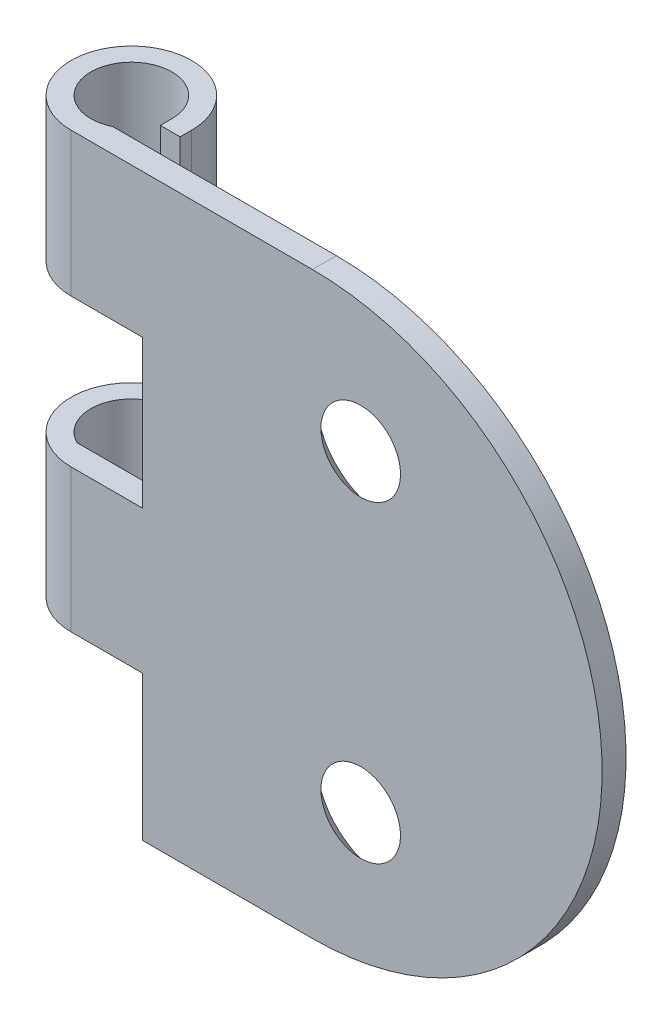
ISO-10303-21;
HEADER;
FILE_DESCRIPTION(('STEP AP214'),'2;1');
FILE_NAME('part.step','',(''),(''),'','','');
FILE_SCHEMA(('AUTOMOTIVE_DESIGN { 1 0 10303 214 1 1 1 1 }'));
ENDSEC;
DATA;
#1=APPLICATION_CONTEXT('core data for automotive mechanical design processes');
#2=APPLICATION_PROTOCOL_DEFINITION('international standard','automotive_design',2000,#1);
#3=PRODUCT_CONTEXT('',#1,'mechanical');
#4=PRODUCT('Part','Part','',(#3));
#5=PRODUCT_RELATED_PRODUCT_CATEGORY('part','',(#4));
#6=PRODUCT_DEFINITION_FORMATION('','',#4);
#7=PRODUCT_DEFINITION_CONTEXT('part definition',#1,'design');
#8=PRODUCT_DEFINITION('design','',#6,#7);
#9=PRODUCT_DEFINITION_SHAPE('','',#8);
#10=(LENGTH_UNIT() NAMED_UNIT(*) SI_UNIT(.MILLI.,.METRE.));
#11=(NAMED_UNIT(*) PLANE_ANGLE_UNIT() SI_UNIT($,.RADIAN.));
#12=(NAMED_UNIT(*) SI_UNIT($,.STERADIAN.) SOLID_ANGLE_UNIT());
#13=UNCERTAINTY_MEASURE_WITH_UNIT(LENGTH_MEASURE(1.E-05),#10,'distance_accuracy_value','');
#14=(GEOMETRIC_REPRESENTATION_CONTEXT(3) GLOBAL_UNCERTAINTY_ASSIGNED_CONTEXT((#13)) GLOBAL_UNIT_ASSIGNED_CONTEXT((#10,
#11,#12)) REPRESENTATION_CONTEXT('',''));
#15=CARTESIAN_POINT('',(0.,0.,0.));
#16=DIRECTION('',(0.,0.,1.));
#17=DIRECTION('',(1.,0.,0.));
#18=AXIS2_PLACEMENT_3D('',#15,#16,#17);
#19=CARTESIAN_POINT('',(4.699,19.05,-45.9665385922102));
#20=DIRECTION('',(-1.,0.,0.));
#21=DIRECTION('',(0.,-1.,0.));
#22=AXIS2_PLACEMENT_3D('',#19,#20,#21);
#23=PLANE('',#22);
#24=DIRECTION('',(0.,-1.,0.));
#25=VECTOR('',#24,1.);
#26=CARTESIAN_POINT('',(4.699,19.05,3.96875));
#27=LINE('',#26,#25);
#28=CARTESIAN_POINT('',(4.699,9.6012,3.96875));
#29=VERTEX_POINT('',#28);
#30=CARTESIAN_POINT('',(4.699,-0.126999999999999,3.96875));
#31=VERTEX_POINT('',#30);
#32=EDGE_CURVE('E253',#29,#31,#27,.T.);
#33=ORIENTED_EDGE('',*,*,#32,.F.);
#34=DIRECTION('',(0.,0.,-1.));
#35=VECTOR('',#34,1.);
#36=CARTESIAN_POINT('',(4.699,9.6012,2.667));
#37=LINE('',#36,#35);
#38=CARTESIAN_POINT('',(4.699,9.6012,2.39395));
#39=VERTEX_POINT('',#38);
#40=EDGE_CURVE('E218',#29,#39,#37,.T.);
#41=ORIENTED_EDGE('',*,*,#40,.T.);
#42=DIRECTION('',(0.,-1.,0.));
#43=VECTOR('',#42,1.);
#44=CARTESIAN_POINT('',(4.699,19.05,2.39395));
#45=LINE('',#44,#43);
#46=CARTESIAN_POINT('',(4.699,-0.126999999999999,2.39395));
#47=VERTEX_POINT('',#46);
#48=EDGE_CURVE('E80',#39,#47,#45,.T.);
#49=ORIENTED_EDGE('',*,*,#48,.T.);
#50=DIRECTION('',(0.,0.,1.));
#51=VECTOR('',#50,1.);
#52=CARTESIAN_POINT('',(4.699,-0.126999999999999,2.667));
#53=LINE('',#52,#51);
#54=EDGE_CURVE('E210',#47,#31,#53,.T.);
#55=ORIENTED_EDGE('',*,*,#54,.T.);
#56=EDGE_LOOP('',(#33,#41,#49,#55));
#57=FACE_BOUND('',#56,.T.);
#58=ADVANCED_FACE('F46',(#57),#23,.T.);
#59=CARTESIAN_POINT('',(0.,11.6260334940602,3.96875));
#60=DIRECTION('',(0.,0.,-1.));
#61=DIRECTION('',(-1.,0.,0.));
#62=AXIS2_PLACEMENT_3D('',#59,#60,#61);
#63=PLANE('',#62);
#64=CARTESIAN_POINT('',(19.05,10.287,3.96875));
#65=DIRECTION('',(0.,0.,-1.));
#66=DIRECTION('',(-1.,0.,0.));
#67=AXIS2_PLACEMENT_3D('',#64,#65,#66);
#68=CIRCLE('',#67,2.61582226084048);
#69=CARTESIAN_POINT('',(16.4341777391595,10.287,3.96875));
#70=VERTEX_POINT('',#69);
#71=EDGE_CURVE('E240',#70,#70,#68,.T.);
#72=ORIENTED_EDGE('',*,*,#71,.T.);
#73=EDGE_LOOP('',(#72));
#74=FACE_BOUND('',#73,.T.);
#75=CARTESIAN_POINT('',(19.05,-10.287,3.96875));
#76=DIRECTION('',(0.,0.,-1.));
#77=DIRECTION('',(-1.,0.,0.));
#78=AXIS2_PLACEMENT_3D('',#75,#76,#77);
#79=CIRCLE('',#78,2.61582226084048);
#80=CARTESIAN_POINT('',(16.4341777391595,-10.287,3.96875));
#81=VERTEX_POINT('',#80);
#82=EDGE_CURVE('E239',#81,#81,#79,.T.);
#83=ORIENTED_EDGE('',*,*,#82,.T.);
#84=EDGE_LOOP('',(#83));
#85=FACE_BOUND('',#84,.T.);
#86=DIRECTION('',(1.,0.,0.));
#87=VECTOR('',#86,1.);
#88=CARTESIAN_POINT('',(0.,-0.126999999999999,3.96875));
#89=LINE('',#88,#87);
#90=CARTESIAN_POINT('',(0.,-0.126999999999999,3.96875));
#91=VERTEX_POINT('',#90);
#92=EDGE_CURVE('E56',#91,#31,#89,.T.);
#93=ORIENTED_EDGE('',*,*,#92,.F.);
#94=DIRECTION('',(0.,-1.,0.));
#95=VECTOR('',#94,1.);
#96=CARTESIAN_POINT('',(0.,11.6260334940602,3.96875));
#97=LINE('',#96,#95);
#98=CARTESIAN_POINT('',(0.,-9.525,3.96875));
#99=VERTEX_POINT('',#98);
#100=EDGE_CURVE('E301',#91,#99,#97,.T.);
#101=ORIENTED_EDGE('',*,*,#100,.T.);
#102=DIRECTION('',(1.,0.,0.));
#103=VECTOR('',#102,1.);
#104=CARTESIAN_POINT('',(0.,-9.525,3.96875));
#105=LINE('',#104,#103);
#106=CARTESIAN_POINT('',(4.699,-9.525,3.96875));
#107=VERTEX_POINT('',#106);
#108=EDGE_CURVE('E211',#99,#107,#105,.T.);
#109=ORIENTED_EDGE('',*,*,#108,.T.);
#110=CARTESIAN_POINT('',(4.699,-19.05,3.96875));
#111=VERTEX_POINT('',#110);
#112=EDGE_CURVE('E257',#107,#111,#27,.T.);
#113=ORIENTED_EDGE('',*,*,#112,.T.);
#114=DIRECTION('',(1.,0.,0.));
#115=VECTOR('',#114,1.);
#116=CARTESIAN_POINT('',(4.699,-19.05,3.96875));
#117=LINE('',#116,#115);
#118=CARTESIAN_POINT('',(15.875,-19.05,3.96875));
#119=VERTEX_POINT('',#118);
#120=EDGE_CURVE('E256',#111,#119,#117,.T.);
#121=ORIENTED_EDGE('',*,*,#120,.T.);
#122=CARTESIAN_POINT('',(15.875,0.,3.96875));
#123=DIRECTION('',(0.,0.,1.));
#124=DIRECTION('',(1.,0.,0.));
#125=AXIS2_PLACEMENT_3D('',#122,#123,#124);
#126=CIRCLE('',#125,19.05);
#127=CARTESIAN_POINT('',(15.875,19.05,3.96875));
#128=VERTEX_POINT('',#127);
#129=EDGE_CURVE('E302',#119,#128,#126,.T.);
#130=ORIENTED_EDGE('',*,*,#129,.T.);
#131=DIRECTION('',(-1.,0.,0.));
#132=VECTOR('',#131,1.);
#133=CARTESIAN_POINT('',(15.875,19.05,3.96875));
#134=LINE('',#133,#132);
#135=CARTESIAN_POINT('',(0.,19.05,3.96875));
#136=VERTEX_POINT('',#135);
#137=EDGE_CURVE('E264',#128,#136,#134,.T.);
#138=ORIENTED_EDGE('',*,*,#137,.T.);
#139=DIRECTION('',(0.,1.,0.));
#140=VECTOR('',#139,1.);
#141=CARTESIAN_POINT('',(0.,-2.22803349406016,3.96875));
#142=LINE('',#141,#140);
#143=CARTESIAN_POINT('',(0.,9.6012,3.96875));
#144=VERTEX_POINT('',#143);
#145=EDGE_CURVE('E323',#144,#136,#142,.T.);
#146=ORIENTED_EDGE('',*,*,#145,.F.);
#147=DIRECTION('',(-1.,0.,0.));
#148=VECTOR('',#147,1.);
#149=CARTESIAN_POINT('',(0.,9.6012,3.96875));
#150=LINE('',#149,#148);
#151=EDGE_CURVE('E224',#29,#144,#150,.T.);
#152=ORIENTED_EDGE('',*,*,#151,.F.);
#153=ORIENTED_EDGE('',*,*,#32,.T.);
#154=EDGE_LOOP('',(#93,#101,#109,#113,#121,#130,#138,#146,#152,#153));
#155=FACE_BOUND('',#154,.T.);
#156=ADVANCED_FACE('F307',(#74,#85,#155),#63,.F.);
#157=CARTESIAN_POINT('',(0.,11.6260334940602,2.39395));
#158=DIRECTION('',(0.,0.,-1.));
#159=DIRECTION('',(-1.,0.,0.));
#160=AXIS2_PLACEMENT_3D('',#157,#158,#159);
#161=PLANE('',#160);
#162=CARTESIAN_POINT('',(19.05,10.287,2.39395));
#163=DIRECTION('',(0.,0.,-1.));
#164=DIRECTION('',(-1.,0.,0.));
#165=AXIS2_PLACEMENT_3D('',#162,#163,#164);
#166=CIRCLE('',#165,4.49259581845785);
#167=CARTESIAN_POINT('',(14.5574041815421,10.287,2.39395));
#168=VERTEX_POINT('',#167);
#169=EDGE_CURVE('E241',#168,#168,#166,.T.);
#170=ORIENTED_EDGE('',*,*,#169,.F.);
#171=EDGE_LOOP('',(#170));
#172=FACE_BOUND('',#171,.T.);
#173=CARTESIAN_POINT('',(19.05,-10.287,2.39395));
#174=DIRECTION('',(0.,0.,-1.));
#175=DIRECTION('',(-1.,0.,0.));
#176=AXIS2_PLACEMENT_3D('',#173,#174,#175);
#177=CIRCLE('',#176,4.49259581845785);
#178=CARTESIAN_POINT('',(14.5574041815421,-10.287,2.39395));
#179=VERTEX_POINT('',#178);
#180=EDGE_CURVE('E236',#179,#179,#177,.T.);
#181=ORIENTED_EDGE('',*,*,#180,.F.);
#182=EDGE_LOOP('',(#181));
#183=FACE_BOUND('',#182,.T.);
#184=DIRECTION('',(0.,-1.,0.));
#185=VECTOR('',#184,1.);
#186=CARTESIAN_POINT('',(-1.17553919436997,11.6260334940602,2.39395));
#187=LINE('',#186,#185);
#188=CARTESIAN_POINT('',(-1.17553919436997,-0.126999999999999,2.39395));
#189=VERTEX_POINT('',#188);
#190=CARTESIAN_POINT('',(-1.17553919436997,-9.525,2.39395));
#191=VERTEX_POINT('',#190);
#192=EDGE_CURVE('E50',#189,#191,#187,.T.);
#193=ORIENTED_EDGE('',*,*,#192,.F.);
#194=DIRECTION('',(1.,0.,0.));
#195=VECTOR('',#194,1.);
#196=CARTESIAN_POINT('',(0.,-0.126999999999999,2.39395));
#197=LINE('',#196,#195);
#198=EDGE_CURVE('E199',#189,#47,#197,.T.);
#199=ORIENTED_EDGE('',*,*,#198,.T.);
#200=ORIENTED_EDGE('',*,*,#48,.F.);
#201=DIRECTION('',(-1.,0.,0.));
#202=VECTOR('',#201,1.);
#203=CARTESIAN_POINT('',(0.,9.6012,2.39395));
#204=LINE('',#203,#202);
#205=CARTESIAN_POINT('',(1.17553919436997,9.6012,2.39395));
#206=VERTEX_POINT('',#205);
#207=EDGE_CURVE('E65',#39,#206,#204,.T.);
#208=ORIENTED_EDGE('',*,*,#207,.T.);
#209=DIRECTION('',(0.,1.,0.));
#210=VECTOR('',#209,1.);
#211=CARTESIAN_POINT('',(1.17553919436997,-2.22803349406016,2.39395));
#212=LINE('',#211,#210);
#213=CARTESIAN_POINT('',(1.17553919436997,19.05,2.39395));
#214=VERTEX_POINT('',#213);
#215=EDGE_CURVE('E219',#206,#214,#212,.T.);
#216=ORIENTED_EDGE('',*,*,#215,.T.);
#217=DIRECTION('',(-1.,0.,0.));
#218=VECTOR('',#217,1.);
#219=CARTESIAN_POINT('',(15.875,19.05,2.39395));
#220=LINE('',#219,#218);
#221=CARTESIAN_POINT('',(15.875,19.05,2.39395));
#222=VERTEX_POINT('',#221);
#223=EDGE_CURVE('E106',#222,#214,#220,.T.);
#224=ORIENTED_EDGE('',*,*,#223,.F.);
#225=CARTESIAN_POINT('',(15.875,0.,2.39395));
#226=DIRECTION('',(0.,0.,-1.));
#227=DIRECTION('',(-1.,0.,0.));
#228=AXIS2_PLACEMENT_3D('',#225,#226,#227);
#229=CIRCLE('',#228,19.05);
#230=CARTESIAN_POINT('',(15.875,-19.05,2.39395));
#231=VERTEX_POINT('',#230);
#232=EDGE_CURVE('E223',#231,#222,#229,.F.);
#233=ORIENTED_EDGE('',*,*,#232,.F.);
#234=DIRECTION('',(1.,0.,0.));
#235=VECTOR('',#234,1.);
#236=CARTESIAN_POINT('',(4.699,-19.05,2.39395));
#237=LINE('',#236,#235);
#238=CARTESIAN_POINT('',(4.699,-19.05,2.39395));
#239=VERTEX_POINT('',#238);
#240=EDGE_CURVE('E228',#239,#231,#237,.T.);
#241=ORIENTED_EDGE('',*,*,#240,.F.);
#242=DIRECTION('',(0.,-1.,0.));
#243=VECTOR('',#242,1.);
#244=CARTESIAN_POINT('',(4.699,19.05,2.39395));
#245=LINE('',#244,#243);
#246=CARTESIAN_POINT('',(4.699,-9.525,2.39395));
#247=VERTEX_POINT('',#246);
#248=EDGE_CURVE('E91',#247,#239,#245,.T.);
#249=ORIENTED_EDGE('',*,*,#248,.F.);
#250=DIRECTION('',(1.,0.,0.));
#251=VECTOR('',#250,1.);
#252=CARTESIAN_POINT('',(0.,-9.525,2.39395));
#253=LINE('',#252,#251);
#254=EDGE_CURVE('E204',#191,#247,#253,.T.);
#255=ORIENTED_EDGE('',*,*,#254,.F.);
#256=EDGE_LOOP('',(#193,#199,#200,#208,#216,#224,#233,#241,#249,#255));
#257=FACE_BOUND('',#256,.T.);
#258=ADVANCED_FACE('F48',(#172,#183,#257),#161,.T.);
#259=CARTESIAN_POINT('',(0.,11.6260334940602,0.));
#260=DIRECTION('',(0.,-1.,0.));
#261=DIRECTION('',(0.,0.,-1.));
#262=AXIS2_PLACEMENT_3D('',#259,#260,#261);
#263=CYLINDRICAL_SURFACE('',#262,2.667);
#264=DIRECTION('',(0.,-1.,0.));
#265=VECTOR('',#264,1.);
#266=CARTESIAN_POINT('',(2.667,11.6260334940602,0.));
#267=LINE('',#266,#265);
#268=CARTESIAN_POINT('',(2.667,-0.126999999999999,0.));
#269=VERTEX_POINT('',#268);
#270=CARTESIAN_POINT('',(2.667,-9.525,0.));
#271=VERTEX_POINT('',#270);
#272=EDGE_CURVE('E195',#269,#271,#267,.T.);
#273=ORIENTED_EDGE('',*,*,#272,.F.);
#274=CARTESIAN_POINT('',(0.,-0.126999999999999,0.));
#275=DIRECTION('',(0.,1.,0.));
#276=DIRECTION('',(0.,0.,1.));
#277=AXIS2_PLACEMENT_3D('',#274,#275,#276);
#278=CIRCLE('',#277,2.667);
#279=EDGE_CURVE('E193',#269,#189,#278,.T.);
#280=ORIENTED_EDGE('',*,*,#279,.T.);
#281=ORIENTED_EDGE('',*,*,#192,.T.);
#282=CARTESIAN_POINT('',(0.,-9.525,0.));
#283=DIRECTION('',(0.,1.,0.));
#284=DIRECTION('',(0.,0.,1.));
#285=AXIS2_PLACEMENT_3D('',#282,#283,#284);
#286=CIRCLE('',#285,2.667);
#287=EDGE_CURVE('E235',#271,#191,#286,.T.);
#288=ORIENTED_EDGE('',*,*,#287,.F.);
#289=EDGE_LOOP('',(#273,#280,#281,#288));
#290=FACE_BOUND('',#289,.T.);
#291=ADVANCED_FACE('F194',(#290),#263,.F.);
#292=CARTESIAN_POINT('',(2.667,11.6260334940602,0.762));
#293=DIRECTION('',(-1.,0.,0.));
#294=DIRECTION('',(0.,0.,1.));
#295=AXIS2_PLACEMENT_3D('',#292,#293,#294);
#296=PLANE('',#295);
#297=DIRECTION('',(0.,-1.,0.));
#298=VECTOR('',#297,1.);
#299=CARTESIAN_POINT('',(2.667,11.6260334940602,0.762));
#300=LINE('',#299,#298);
#301=CARTESIAN_POINT('',(2.667,-0.126999999999999,0.762));
#302=VERTEX_POINT('',#301);
#303=CARTESIAN_POINT('',(2.667,-9.525,0.762));
#304=VERTEX_POINT('',#303);
#305=EDGE_CURVE('E297',#302,#304,#300,.T.);
#306=ORIENTED_EDGE('',*,*,#305,.F.);
#307=DIRECTION('',(0.,0.,-1.));
#308=VECTOR('',#307,1.);
#309=CARTESIAN_POINT('',(2.667,-0.126999999999999,0.762));
#310=LINE('',#309,#308);
#311=EDGE_CURVE('E206',#302,#269,#310,.T.);
#312=ORIENTED_EDGE('',*,*,#311,.T.);
#313=ORIENTED_EDGE('',*,*,#272,.T.);
#314=DIRECTION('',(0.,0.,-1.));
#315=VECTOR('',#314,1.);
#316=CARTESIAN_POINT('',(2.667,-9.525,0.762));
#317=LINE('',#316,#315);
#318=EDGE_CURVE('E245',#304,#271,#317,.T.);
#319=ORIENTED_EDGE('',*,*,#318,.F.);
#320=EDGE_LOOP('',(#306,#312,#313,#319));
#321=FACE_BOUND('',#320,.T.);
#322=ADVANCED_FACE('F382',(#321),#296,.T.);
#323=CARTESIAN_POINT('',(3.96875,11.6260334940602,0.762));
#324=DIRECTION('',(0.,0.,1.));
#325=DIRECTION('',(1.,0.,0.));
#326=AXIS2_PLACEMENT_3D('',#323,#324,#325);
#327=PLANE('',#326);
#328=DIRECTION('',(0.,-1.,0.));
#329=VECTOR('',#328,1.);
#330=CARTESIAN_POINT('',(3.96875,11.6260334940602,0.762));
#331=LINE('',#330,#329);
#332=CARTESIAN_POINT('',(3.96875,-0.126999999999999,0.762));
#333=VERTEX_POINT('',#332);
#334=CARTESIAN_POINT('',(3.96875,-9.525,0.762));
#335=VERTEX_POINT('',#334);
#336=EDGE_CURVE('E277',#333,#335,#331,.T.);
#337=ORIENTED_EDGE('',*,*,#336,.F.);
#338=DIRECTION('',(-1.,0.,0.));
#339=VECTOR('',#338,1.);
#340=CARTESIAN_POINT('',(3.96875,-0.126999999999999,0.762));
#341=LINE('',#340,#339);
#342=EDGE_CURVE('E296',#333,#302,#341,.T.);
#343=ORIENTED_EDGE('',*,*,#342,.T.);
#344=ORIENTED_EDGE('',*,*,#305,.T.);
#345=DIRECTION('',(-1.,0.,0.));
#346=VECTOR('',#345,1.);
#347=CARTESIAN_POINT('',(3.96875,-9.525,0.762));
#348=LINE('',#347,#346);
#349=EDGE_CURVE('E272',#335,#304,#348,.T.);
#350=ORIENTED_EDGE('',*,*,#349,.F.);
#351=EDGE_LOOP('',(#337,#343,#344,#350));
#352=FACE_BOUND('',#351,.T.);
#353=ADVANCED_FACE('F385',(#352),#327,.T.);
#354=CARTESIAN_POINT('',(3.96875,11.6260334940602,0.762));
#355=DIRECTION('',(-1.,0.,0.));
#356=DIRECTION('',(0.,0.,1.));
#357=AXIS2_PLACEMENT_3D('',#354,#355,#356);
#358=PLANE('',#357);
#359=DIRECTION('',(0.,0.,-1.));
#360=VECTOR('',#359,1.);
#361=CARTESIAN_POINT('',(3.96875,-0.126999999999999,0.762));
#362=LINE('',#361,#360);
#363=CARTESIAN_POINT('',(3.96875,-0.126999999999999,0.));
#364=VERTEX_POINT('',#363);
#365=EDGE_CURVE('E14',#333,#364,#362,.T.);
#366=ORIENTED_EDGE('',*,*,#365,.F.);
#367=ORIENTED_EDGE('',*,*,#336,.T.);
#368=DIRECTION('',(0.,0.,-1.));
#369=VECTOR('',#368,1.);
#370=CARTESIAN_POINT('',(3.96875,-9.525,0.762));
#371=LINE('',#370,#369);
#372=CARTESIAN_POINT('',(3.96875,-9.525,0.));
#373=VERTEX_POINT('',#372);
#374=EDGE_CURVE('E274',#335,#373,#371,.T.);
#375=ORIENTED_EDGE('',*,*,#374,.T.);
#376=DIRECTION('',(0.,-1.,0.));
#377=VECTOR('',#376,1.);
#378=CARTESIAN_POINT('',(3.96875,11.6260334940602,0.));
#379=LINE('',#378,#377);
#380=EDGE_CURVE('E273',#364,#373,#379,.T.);
#381=ORIENTED_EDGE('',*,*,#380,.F.);
#382=EDGE_LOOP('',(#366,#367,#375,#381));
#383=FACE_BOUND('',#382,.T.);
#384=ADVANCED_FACE('F389',(#383),#358,.F.);
#385=CARTESIAN_POINT('',(0.,11.6260334940602,0.));
#386=DIRECTION('',(0.,-1.,0.));
#387=DIRECTION('',(0.,0.,-1.));
#388=AXIS2_PLACEMENT_3D('',#385,#386,#387);
#389=CYLINDRICAL_SURFACE('',#388,3.96875);
#390=CARTESIAN_POINT('',(0.,-0.126999999999999,0.));
#391=DIRECTION('',(0.,1.,0.));
#392=DIRECTION('',(0.,0.,1.));
#393=AXIS2_PLACEMENT_3D('',#390,#391,#392);
#394=CIRCLE('',#393,3.96875);
#395=EDGE_CURVE('E287',#364,#91,#394,.T.);
#396=ORIENTED_EDGE('',*,*,#395,.F.);
#397=ORIENTED_EDGE('',*,*,#380,.T.);
#398=CARTESIAN_POINT('',(0.,-9.525,0.));
#399=DIRECTION('',(0.,1.,0.));
#400=DIRECTION('',(1.,0.,0.));
#401=AXIS2_PLACEMENT_3D('',#398,#399,#400);
#402=CIRCLE('',#401,3.96875);
#403=EDGE_CURVE('E269',#373,#99,#402,.T.);
#404=ORIENTED_EDGE('',*,*,#403,.T.);
#405=ORIENTED_EDGE('',*,*,#100,.F.);
#406=EDGE_LOOP('',(#396,#397,#404,#405));
#407=FACE_BOUND('',#406,.T.);
#408=ADVANCED_FACE('F377',(#407),#389,.T.);
#409=CARTESIAN_POINT('',(0.,-9.525,0.));
#410=DIRECTION('',(0.,1.,0.));
#411=DIRECTION('',(0.,0.,1.));
#412=AXIS2_PLACEMENT_3D('',#409,#410,#411);
#413=PLANE('',#412);
#414=ORIENTED_EDGE('',*,*,#108,.F.);
#415=ORIENTED_EDGE('',*,*,#403,.F.);
#416=ORIENTED_EDGE('',*,*,#374,.F.);
#417=ORIENTED_EDGE('',*,*,#349,.T.);
#418=ORIENTED_EDGE('',*,*,#318,.T.);
#419=ORIENTED_EDGE('',*,*,#287,.T.);
#420=ORIENTED_EDGE('',*,*,#254,.T.);
#421=DIRECTION('',(0.,0.,1.));
#422=VECTOR('',#421,1.);
#423=CARTESIAN_POINT('',(4.699,-9.525,2.667));
#424=LINE('',#423,#422);
#425=EDGE_CURVE('E234',#247,#107,#424,.T.);
#426=ORIENTED_EDGE('',*,*,#425,.T.);
#427=EDGE_LOOP('',(#414,#415,#416,#417,#418,#419,#420,#426));
#428=FACE_BOUND('',#427,.T.);
#429=ADVANCED_FACE('F311',(#428),#413,.F.);
#430=CARTESIAN_POINT('',(0.,-0.126999999999999,0.));
#431=DIRECTION('',(0.,1.,0.));
#432=DIRECTION('',(0.,0.,1.));
#433=AXIS2_PLACEMENT_3D('',#430,#431,#432);
#434=PLANE('',#433);
#435=ORIENTED_EDGE('',*,*,#395,.T.);
#436=ORIENTED_EDGE('',*,*,#92,.T.);
#437=ORIENTED_EDGE('',*,*,#54,.F.);
#438=ORIENTED_EDGE('',*,*,#198,.F.);
#439=ORIENTED_EDGE('',*,*,#279,.F.);
#440=ORIENTED_EDGE('',*,*,#311,.F.);
#441=ORIENTED_EDGE('',*,*,#342,.F.);
#442=ORIENTED_EDGE('',*,*,#365,.T.);
#443=EDGE_LOOP('',(#435,#436,#437,#438,#439,#440,#441,#442));
#444=FACE_BOUND('',#443,.T.);
#445=ADVANCED_FACE('F208',(#444),#434,.T.);
#446=ORIENTED_EDGE('',*,*,#425,.F.);
#447=ORIENTED_EDGE('',*,*,#248,.T.);
#448=DIRECTION('',(0.,0.,1.));
#449=VECTOR('',#448,1.);
#450=CARTESIAN_POINT('',(4.699,-19.05,-45.9665385922102));
#451=LINE('',#450,#449);
#452=EDGE_CURVE('E215',#239,#111,#451,.T.);
#453=ORIENTED_EDGE('',*,*,#452,.T.);
#454=ORIENTED_EDGE('',*,*,#112,.F.);
#455=EDGE_LOOP('',(#446,#447,#453,#454));
#456=FACE_BOUND('',#455,.T.);
#457=ADVANCED_FACE('F312',(#456),#23,.T.);
#458=CARTESIAN_POINT('',(15.875,19.05,-45.9665385922102));
#459=DIRECTION('',(0.,1.,0.));
#460=DIRECTION('',(0.,0.,1.));
#461=AXIS2_PLACEMENT_3D('',#458,#459,#460);
#462=PLANE('',#461);
#463=DIRECTION('',(0.,0.,1.));
#464=VECTOR('',#463,1.);
#465=CARTESIAN_POINT('',(15.875,19.05,-45.9665385922102));
#466=LINE('',#465,#464);
#467=EDGE_CURVE('E227',#222,#128,#466,.T.);
#468=ORIENTED_EDGE('',*,*,#467,.F.);
#469=ORIENTED_EDGE('',*,*,#223,.T.);
#470=CARTESIAN_POINT('',(0.,19.05,0.));
#471=DIRECTION('',(0.,1.,0.));
#472=DIRECTION('',(0.,0.,1.));
#473=AXIS2_PLACEMENT_3D('',#470,#471,#472);
#474=CIRCLE('',#473,2.667);
#475=CARTESIAN_POINT('',(2.667,19.05,0.));
#476=VERTEX_POINT('',#475);
#477=EDGE_CURVE('E248',#476,#214,#474,.T.);
#478=ORIENTED_EDGE('',*,*,#477,.F.);
#479=DIRECTION('',(0.,0.,-1.));
#480=VECTOR('',#479,1.);
#481=CARTESIAN_POINT('',(2.667,19.05,0.762));
#482=LINE('',#481,#480);
#483=CARTESIAN_POINT('',(2.667,19.05,0.762));
#484=VERTEX_POINT('',#483);
#485=EDGE_CURVE('E250',#484,#476,#482,.T.);
#486=ORIENTED_EDGE('',*,*,#485,.F.);
#487=DIRECTION('',(-1.,0.,0.));
#488=VECTOR('',#487,1.);
#489=CARTESIAN_POINT('',(3.96875,19.05,0.762));
#490=LINE('',#489,#488);
#491=CARTESIAN_POINT('',(3.96875,19.05,0.762));
#492=VERTEX_POINT('',#491);
#493=EDGE_CURVE('E340',#492,#484,#490,.T.);
#494=ORIENTED_EDGE('',*,*,#493,.F.);
#495=DIRECTION('',(0.,0.,-1.));
#496=VECTOR('',#495,1.);
#497=CARTESIAN_POINT('',(3.96875,19.05,0.762));
#498=LINE('',#497,#496);
#499=CARTESIAN_POINT('',(3.96875,19.05,0.));
#500=VERTEX_POINT('',#499);
#501=EDGE_CURVE('E338',#492,#500,#498,.T.);
#502=ORIENTED_EDGE('',*,*,#501,.T.);
#503=CARTESIAN_POINT('',(0.,19.05,0.));
#504=DIRECTION('',(0.,1.,0.));
#505=DIRECTION('',(1.,0.,0.));
#506=AXIS2_PLACEMENT_3D('',#503,#504,#505);
#507=CIRCLE('',#506,3.96875);
#508=EDGE_CURVE('E221',#500,#136,#507,.T.);
#509=ORIENTED_EDGE('',*,*,#508,.T.);
#510=ORIENTED_EDGE('',*,*,#137,.F.);
#511=EDGE_LOOP('',(#468,#469,#478,#486,#494,#502,#509,#510));
#512=FACE_BOUND('',#511,.T.);
#513=ADVANCED_FACE('F335',(#512),#462,.T.);
#514=CARTESIAN_POINT('',(15.875,0.,-45.9665385922102));
#515=DIRECTION('',(0.,0.,1.));
#516=DIRECTION('',(1.,0.,0.));
#517=AXIS2_PLACEMENT_3D('',#514,#515,#516);
#518=CYLINDRICAL_SURFACE('',#517,19.05);
#519=DIRECTION('',(0.,0.,1.));
#520=VECTOR('',#519,1.);
#521=CARTESIAN_POINT('',(15.875,-19.05,-45.9665385922102));
#522=LINE('',#521,#520);
#523=EDGE_CURVE('E231',#231,#119,#522,.T.);
#524=ORIENTED_EDGE('',*,*,#523,.F.);
#525=ORIENTED_EDGE('',*,*,#232,.T.);
#526=ORIENTED_EDGE('',*,*,#467,.T.);
#527=ORIENTED_EDGE('',*,*,#129,.F.);
#528=EDGE_LOOP('',(#524,#525,#526,#527));
#529=FACE_BOUND('',#528,.T.);
#530=ADVANCED_FACE('F351',(#529),#518,.T.);
#531=CARTESIAN_POINT('',(4.699,-19.05,-45.9665385922102));
#532=DIRECTION('',(0.,-1.,0.));
#533=DIRECTION('',(0.,0.,-1.));
#534=AXIS2_PLACEMENT_3D('',#531,#532,#533);
#535=PLANE('',#534);
#536=ORIENTED_EDGE('',*,*,#452,.F.);
#537=ORIENTED_EDGE('',*,*,#240,.T.);
#538=ORIENTED_EDGE('',*,*,#523,.T.);
#539=ORIENTED_EDGE('',*,*,#120,.F.);
#540=EDGE_LOOP('',(#536,#537,#538,#539));
#541=FACE_BOUND('',#540,.T.);
#542=ADVANCED_FACE('F317',(#541),#535,.T.);
#543=CARTESIAN_POINT('',(0.,-2.22803349406016,0.));
#544=DIRECTION('',(0.,1.,0.));
#545=DIRECTION('',(0.,0.,1.));
#546=AXIS2_PLACEMENT_3D('',#543,#544,#545);
#547=CYLINDRICAL_SURFACE('',#546,2.667);
#548=ORIENTED_EDGE('',*,*,#215,.F.);
#549=CARTESIAN_POINT('',(0.,9.6012,0.));
#550=DIRECTION('',(0.,1.,0.));
#551=DIRECTION('',(0.,0.,1.));
#552=AXIS2_PLACEMENT_3D('',#549,#550,#551);
#553=CIRCLE('',#552,2.667);
#554=CARTESIAN_POINT('',(2.667,9.6012,0.));
#555=VERTEX_POINT('',#554);
#556=EDGE_CURVE('E217',#206,#555,#553,.F.);
#557=ORIENTED_EDGE('',*,*,#556,.T.);
#558=DIRECTION('',(0.,1.,0.));
#559=VECTOR('',#558,1.);
#560=CARTESIAN_POINT('',(2.667,-2.22803349406016,0.));
#561=LINE('',#560,#559);
#562=EDGE_CURVE('E115',#555,#476,#561,.T.);
#563=ORIENTED_EDGE('',*,*,#562,.T.);
#564=ORIENTED_EDGE('',*,*,#477,.T.);
#565=EDGE_LOOP('',(#548,#557,#563,#564));
#566=FACE_BOUND('',#565,.T.);
#567=ADVANCED_FACE('F358',(#566),#547,.F.);
#568=CARTESIAN_POINT('',(2.667,-2.22803349406016,0.762));
#569=DIRECTION('',(1.,0.,0.));
#570=DIRECTION('',(0.,0.,-1.));
#571=AXIS2_PLACEMENT_3D('',#568,#569,#570);
#572=PLANE('',#571);
#573=ORIENTED_EDGE('',*,*,#562,.F.);
#574=DIRECTION('',(0.,0.,1.));
#575=VECTOR('',#574,1.);
#576=CARTESIAN_POINT('',(2.667,9.6012,0.762));
#577=LINE('',#576,#575);
#578=CARTESIAN_POINT('',(2.667,9.6012,0.762));
#579=VERTEX_POINT('',#578);
#580=EDGE_CURVE('E247',#555,#579,#577,.T.);
#581=ORIENTED_EDGE('',*,*,#580,.T.);
#582=DIRECTION('',(0.,1.,0.));
#583=VECTOR('',#582,1.);
#584=CARTESIAN_POINT('',(2.667,-2.22803349406016,0.762));
#585=LINE('',#584,#583);
#586=EDGE_CURVE('E347',#579,#484,#585,.T.);
#587=ORIENTED_EDGE('',*,*,#586,.T.);
#588=ORIENTED_EDGE('',*,*,#485,.T.);
#589=EDGE_LOOP('',(#573,#581,#587,#588));
#590=FACE_BOUND('',#589,.T.);
#591=ADVANCED_FACE('F449',(#590),#572,.F.);
#592=CARTESIAN_POINT('',(3.96875,-2.22803349406016,0.762));
#593=DIRECTION('',(0.,0.,-1.));
#594=DIRECTION('',(-1.,0.,0.));
#595=AXIS2_PLACEMENT_3D('',#592,#593,#594);
#596=PLANE('',#595);
#597=ORIENTED_EDGE('',*,*,#586,.F.);
#598=DIRECTION('',(1.,0.,0.));
#599=VECTOR('',#598,1.);
#600=CARTESIAN_POINT('',(3.96875,9.6012,0.762));
#601=LINE('',#600,#599);
#602=CARTESIAN_POINT('',(3.96875,9.6012,0.762));
#603=VERTEX_POINT('',#602);
#604=EDGE_CURVE('E417',#579,#603,#601,.T.);
#605=ORIENTED_EDGE('',*,*,#604,.T.);
#606=DIRECTION('',(0.,1.,0.));
#607=VECTOR('',#606,1.);
#608=CARTESIAN_POINT('',(3.96875,-2.22803349406016,0.762));
#609=LINE('',#608,#607);
#610=EDGE_CURVE('E345',#603,#492,#609,.T.);
#611=ORIENTED_EDGE('',*,*,#610,.T.);
#612=ORIENTED_EDGE('',*,*,#493,.T.);
#613=EDGE_LOOP('',(#597,#605,#611,#612));
#614=FACE_BOUND('',#613,.T.);
#615=ADVANCED_FACE('F445',(#614),#596,.F.);
#616=CARTESIAN_POINT('',(3.96875,-2.22803349406016,0.762));
#617=DIRECTION('',(1.,0.,0.));
#618=DIRECTION('',(0.,0.,-1.));
#619=AXIS2_PLACEMENT_3D('',#616,#617,#618);
#620=PLANE('',#619);
#621=DIRECTION('',(0.,0.,1.));
#622=VECTOR('',#621,1.);
#623=CARTESIAN_POINT('',(3.96875,9.6012,0.762));
#624=LINE('',#623,#622);
#625=CARTESIAN_POINT('',(3.96875,9.6012,0.));
#626=VERTEX_POINT('',#625);
#627=EDGE_CURVE('E415',#626,#603,#624,.T.);
#628=ORIENTED_EDGE('',*,*,#627,.F.);
#629=DIRECTION('',(0.,1.,0.));
#630=VECTOR('',#629,1.);
#631=CARTESIAN_POINT('',(3.96875,-2.22803349406016,0.));
#632=LINE('',#631,#630);
#633=EDGE_CURVE('E332',#626,#500,#632,.T.);
#634=ORIENTED_EDGE('',*,*,#633,.T.);
#635=ORIENTED_EDGE('',*,*,#501,.F.);
#636=ORIENTED_EDGE('',*,*,#610,.F.);
#637=EDGE_LOOP('',(#628,#634,#635,#636));
#638=FACE_BOUND('',#637,.T.);
#639=ADVANCED_FACE('F442',(#638),#620,.T.);
#640=CARTESIAN_POINT('',(0.,-2.22803349406016,0.));
#641=DIRECTION('',(0.,1.,0.));
#642=DIRECTION('',(0.,0.,1.));
#643=AXIS2_PLACEMENT_3D('',#640,#641,#642);
#644=CYLINDRICAL_SURFACE('',#643,3.96875);
#645=CARTESIAN_POINT('',(0.,9.6012,0.));
#646=DIRECTION('',(0.,1.,0.));
#647=DIRECTION('',(0.,0.,1.));
#648=AXIS2_PLACEMENT_3D('',#645,#646,#647);
#649=CIRCLE('',#648,3.96875);
#650=EDGE_CURVE('E331',#144,#626,#649,.F.);
#651=ORIENTED_EDGE('',*,*,#650,.F.);
#652=ORIENTED_EDGE('',*,*,#145,.T.);
#653=ORIENTED_EDGE('',*,*,#508,.F.);
#654=ORIENTED_EDGE('',*,*,#633,.F.);
#655=EDGE_LOOP('',(#651,#652,#653,#654));
#656=FACE_BOUND('',#655,.T.);
#657=ADVANCED_FACE('F329',(#656),#644,.T.);
#658=CARTESIAN_POINT('',(0.,9.6012,0.));
#659=DIRECTION('',(0.,1.,0.));
#660=DIRECTION('',(0.,0.,1.));
#661=AXIS2_PLACEMENT_3D('',#658,#659,#660);
#662=PLANE('',#661);
#663=ORIENTED_EDGE('',*,*,#151,.T.);
#664=ORIENTED_EDGE('',*,*,#650,.T.);
#665=ORIENTED_EDGE('',*,*,#627,.T.);
#666=ORIENTED_EDGE('',*,*,#604,.F.);
#667=ORIENTED_EDGE('',*,*,#580,.F.);
#668=ORIENTED_EDGE('',*,*,#556,.F.);
#669=ORIENTED_EDGE('',*,*,#207,.F.);
#670=ORIENTED_EDGE('',*,*,#40,.F.);
#671=EDGE_LOOP('',(#663,#664,#665,#666,#667,#668,#669,#670));
#672=FACE_BOUND('',#671,.T.);
#673=ADVANCED_FACE('F406',(#672),#662,.F.);
#674=CARTESIAN_POINT('',(19.05,-10.287,2.667));
#675=DIRECTION('',(0.,0.,-1.));
#676=DIRECTION('',(-1.,0.,0.));
#677=AXIS2_PLACEMENT_3D('',#674,#675,#676);
#678=CONICAL_SURFACE('',#677,4.1671875,0.872664625997167);
#679=ORIENTED_EDGE('',*,*,#180,.T.);
#680=EDGE_LOOP('',(#679));
#681=FACE_BOUND('',#680,.T.);
#682=ORIENTED_EDGE('',*,*,#82,.F.);
#683=EDGE_LOOP('',(#682));
#684=FACE_BOUND('',#683,.T.);
#685=ADVANCED_FACE('F429',(#681,#684),#678,.F.);
#686=CARTESIAN_POINT('',(19.05,10.287,2.667));
#687=DIRECTION('',(0.,0.,-1.));
#688=DIRECTION('',(-1.,0.,0.));
#689=AXIS2_PLACEMENT_3D('',#686,#687,#688);
#690=CONICAL_SURFACE('',#689,4.1671875,0.872664625997167);
#691=ORIENTED_EDGE('',*,*,#169,.T.);
#692=EDGE_LOOP('',(#691));
#693=FACE_BOUND('',#692,.T.);
#694=ORIENTED_EDGE('',*,*,#71,.F.);
#695=EDGE_LOOP('',(#694));
#696=FACE_BOUND('',#695,.T.);
#697=ADVANCED_FACE('F427',(#693,#696),#690,.F.);
#698=CLOSED_SHELL('',(#58,#156,#258,#291,#322,#353,#384,#408,#429,#445,#457,#513,#530,#542,#567,
#591,#615,#639,#657,#673,#685,#697));
#699=MANIFOLD_SOLID_BREP('B2',#698);
#700=ADVANCED_BREP_SHAPE_REPRESENTATION('',(#18,#699),#14);
#701=SHAPE_DEFINITION_REPRESENTATION(#9,#700);
ENDSEC;
END-ISO-10303-21;
